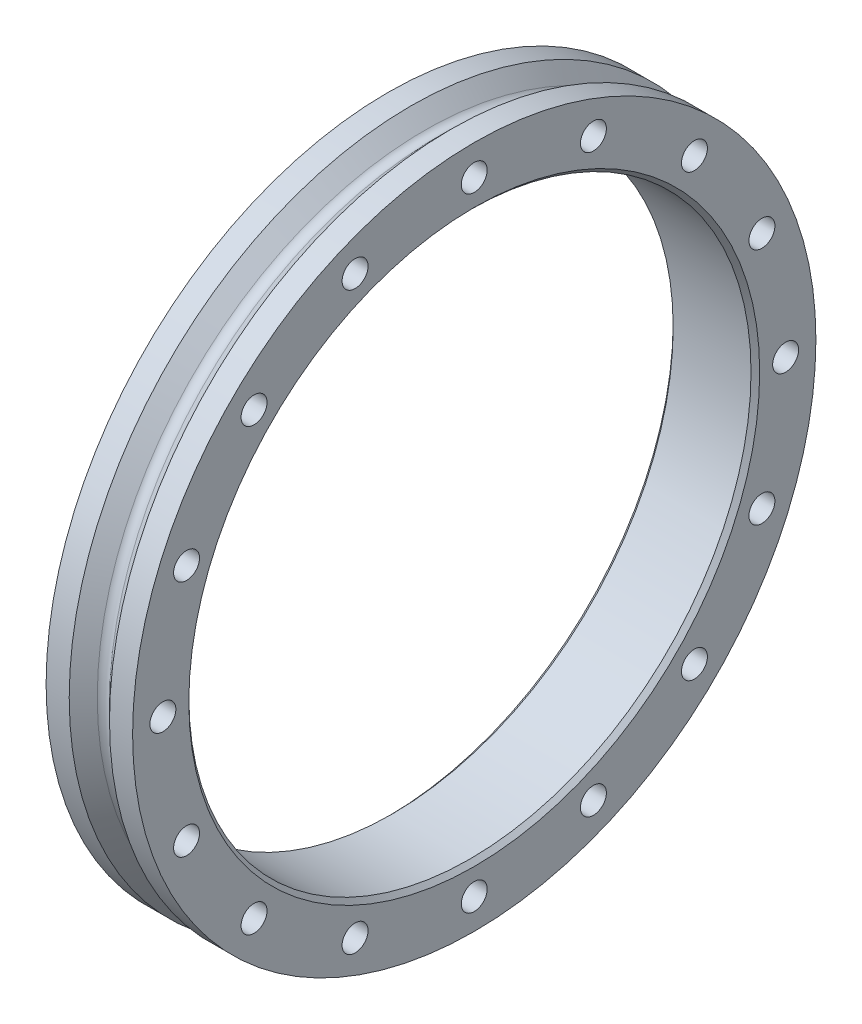
ISO-10303-21;
HEADER;
FILE_DESCRIPTION(('STEP AP214'),'2;1');
FILE_NAME('part.step','',(''),(''),'','','');
FILE_SCHEMA(('AUTOMOTIVE_DESIGN { 1 0 10303 214 1 1 1 1 }'));
ENDSEC;
DATA;
#1=APPLICATION_CONTEXT('core data for automotive mechanical design processes');
#2=APPLICATION_PROTOCOL_DEFINITION('international standard','automotive_design',2000,#1);
#3=PRODUCT_CONTEXT('',#1,'mechanical');
#4=PRODUCT('Part','Part','',(#3));
#5=PRODUCT_RELATED_PRODUCT_CATEGORY('part','',(#4));
#6=PRODUCT_DEFINITION_FORMATION('','',#4);
#7=PRODUCT_DEFINITION_CONTEXT('part definition',#1,'design');
#8=PRODUCT_DEFINITION('design','',#6,#7);
#9=PRODUCT_DEFINITION_SHAPE('','',#8);
#10=(LENGTH_UNIT() NAMED_UNIT(*) SI_UNIT(.MILLI.,.METRE.));
#11=(NAMED_UNIT(*) PLANE_ANGLE_UNIT() SI_UNIT($,.RADIAN.));
#12=(NAMED_UNIT(*) SI_UNIT($,.STERADIAN.) SOLID_ANGLE_UNIT());
#13=UNCERTAINTY_MEASURE_WITH_UNIT(LENGTH_MEASURE(1.E-05),#10,'distance_accuracy_value','');
#14=(GEOMETRIC_REPRESENTATION_CONTEXT(3) GLOBAL_UNCERTAINTY_ASSIGNED_CONTEXT((#13)) GLOBAL_UNIT_ASSIGNED_CONTEXT((#10,
#11,#12)) REPRESENTATION_CONTEXT('',''));
#15=CARTESIAN_POINT('',(0.,0.,0.));
#16=DIRECTION('',(0.,0.,1.));
#17=DIRECTION('',(1.,0.,0.));
#18=AXIS2_PLACEMENT_3D('',#15,#16,#17);
#19=CARTESIAN_POINT('',(-4.65685424949239,0.,0.));
#20=DIRECTION('',(-1.,0.,0.));
#21=DIRECTION('',(0.,0.,1.));
#22=AXIS2_PLACEMENT_3D('',#19,#20,#21);
#23=CONICAL_SURFACE('',#22,79.,0.785398163397445);
#24=CARTESIAN_POINT('',(-1.41421356237308,0.,0.));
#25=DIRECTION('',(1.,0.,0.));
#26=DIRECTION('',(0.,0.,-1.));
#27=AXIS2_PLACEMENT_3D('',#24,#25,#26);
#28=CIRCLE('',#27,75.7573593128807);
#29=CARTESIAN_POINT('',(-1.41421356237308,0.,-75.7573593128807));
#30=VERTEX_POINT('',#29);
#31=EDGE_CURVE('E39',#30,#30,#28,.F.);
#32=ORIENTED_EDGE('',*,*,#31,.T.);
#33=EDGE_LOOP('',(#32));
#34=FACE_BOUND('',#33,.T.);
#35=CARTESIAN_POINT('',(-4.65685424949239,0.,0.));
#36=DIRECTION('',(-1.,0.,0.));
#37=DIRECTION('',(0.,0.,1.));
#38=AXIS2_PLACEMENT_3D('',#35,#36,#37);
#39=CIRCLE('',#38,79.);
#40=CARTESIAN_POINT('',(-4.65685424949239,0.,79.));
#41=VERTEX_POINT('',#40);
#42=EDGE_CURVE('E58',#41,#41,#39,.T.);
#43=ORIENTED_EDGE('',*,*,#42,.F.);
#44=EDGE_LOOP('',(#43));
#45=FACE_BOUND('',#44,.T.);
#46=ADVANCED_FACE('F32',(#34,#45),#23,.T.);
#47=CARTESIAN_POINT('',(-42.0673076923077,0.,0.));
#48=DIRECTION('',(-1.,0.,0.));
#49=DIRECTION('',(0.,0.,1.));
#50=AXIS2_PLACEMENT_3D('',#47,#48,#49);
#51=CYLINDRICAL_SURFACE('',#50,79.);
#52=CARTESIAN_POINT('',(-10.,0.,0.));
#53=DIRECTION('',(-1.,0.,0.));
#54=DIRECTION('',(0.,0.,1.));
#55=AXIS2_PLACEMENT_3D('',#52,#53,#54);
#56=CIRCLE('',#55,79.);
#57=CARTESIAN_POINT('',(-10.,0.,79.));
#58=VERTEX_POINT('',#57);
#59=EDGE_CURVE('E61',#58,#58,#56,.T.);
#60=ORIENTED_EDGE('',*,*,#59,.F.);
#61=EDGE_LOOP('',(#60));
#62=FACE_BOUND('',#61,.T.);
#63=ORIENTED_EDGE('',*,*,#42,.T.);
#64=EDGE_LOOP('',(#63));
#65=FACE_BOUND('',#64,.T.);
#66=ADVANCED_FACE('F207',(#62,#65),#51,.T.);
#67=CARTESIAN_POINT('',(-10.,0.,0.));
#68=DIRECTION('',(1.,0.,0.));
#69=DIRECTION('',(0.,0.,-1.));
#70=AXIS2_PLACEMENT_3D('',#67,#68,#69);
#71=PLANE('',#70);
#72=CARTESIAN_POINT('',(-10.,50.9116882454313,-50.9116882454315));
#73=DIRECTION('',(1.,0.,0.));
#74=DIRECTION('',(0.,-0.707106781186549,-0.707106781186546));
#75=AXIS2_PLACEMENT_3D('',#72,#73,#74);
#76=CIRCLE('',#75,3.);
#77=CARTESIAN_POINT('',(-10.,48.7903679018717,-53.0330085889912));
#78=VERTEX_POINT('',#77);
#79=EDGE_CURVE('E80',#78,#78,#76,.T.);
#80=ORIENTED_EDGE('',*,*,#79,.T.);
#81=EDGE_LOOP('',(#80));
#82=FACE_BOUND('',#81,.T.);
#83=CARTESIAN_POINT('',(-10.,27.5532071302863,-66.5193263408127));
#84=DIRECTION('',(1.,0.,0.));
#85=DIRECTION('',(0.,-0.923879532511288,-0.382683432365087));
#86=AXIS2_PLACEMENT_3D('',#83,#84,#85);
#87=CIRCLE('',#86,3.);
#88=CARTESIAN_POINT('',(-10.,24.7815685327524,-67.667376637908));
#89=VERTEX_POINT('',#88);
#90=EDGE_CURVE('E123',#89,#89,#87,.T.);
#91=ORIENTED_EDGE('',*,*,#90,.T.);
#92=EDGE_LOOP('',(#91));
#93=FACE_BOUND('',#92,.T.);
#94=CARTESIAN_POINT('',(-10.,-2.51386656396706E-13,-72.));
#95=DIRECTION('',(1.,0.,0.));
#96=DIRECTION('',(0.,-1.,0.));
#97=AXIS2_PLACEMENT_3D('',#94,#95,#96);
#98=CIRCLE('',#97,3.);
#99=CARTESIAN_POINT('',(-10.,-3.00000000000025,-72.));
#100=VERTEX_POINT('',#99);
#101=EDGE_CURVE('E117',#100,#100,#98,.T.);
#102=ORIENTED_EDGE('',*,*,#101,.T.);
#103=EDGE_LOOP('',(#102));
#104=FACE_BOUND('',#103,.T.);
#105=CARTESIAN_POINT('',(-10.,-27.5532071302868,-66.5193263408125));
#106=DIRECTION('',(1.,0.,0.));
#107=DIRECTION('',(0.,-0.923879532511285,0.382683432365094));
#108=AXIS2_PLACEMENT_3D('',#105,#106,#107);
#109=CIRCLE('',#108,3.);
#110=CARTESIAN_POINT('',(-10.,-30.3248457278206,-65.3712760437173));
#111=VERTEX_POINT('',#110);
#112=EDGE_CURVE('E111',#111,#111,#109,.T.);
#113=ORIENTED_EDGE('',*,*,#112,.T.);
#114=EDGE_LOOP('',(#113));
#115=FACE_BOUND('',#114,.T.);
#116=CARTESIAN_POINT('',(-10.,-50.9116882454317,-50.9116882454312));
#117=DIRECTION('',(1.,0.,0.));
#118=DIRECTION('',(0.,-0.707106781186544,0.707106781186551));
#119=AXIS2_PLACEMENT_3D('',#116,#117,#118);
#120=CIRCLE('',#119,3.);
#121=CARTESIAN_POINT('',(-10.,-53.0330085889913,-48.7903679018715));
#122=VERTEX_POINT('',#121);
#123=EDGE_CURVE('E105',#122,#122,#120,.T.);
#124=ORIENTED_EDGE('',*,*,#123,.T.);
#125=EDGE_LOOP('',(#124));
#126=FACE_BOUND('',#125,.T.);
#127=CARTESIAN_POINT('',(-10.,-66.5193263408128,-27.5532071302861));
#128=DIRECTION('',(1.,0.,0.));
#129=DIRECTION('',(0.,-0.382683432365084,0.923879532511289));
#130=AXIS2_PLACEMENT_3D('',#127,#128,#129);
#131=CIRCLE('',#130,3.);
#132=CARTESIAN_POINT('',(-10.,-67.6673766379081,-24.7815685327522));
#133=VERTEX_POINT('',#132);
#134=EDGE_CURVE('E99',#133,#133,#131,.T.);
#135=ORIENTED_EDGE('',*,*,#134,.T.);
#136=EDGE_LOOP('',(#135));
#137=FACE_BOUND('',#136,.T.);
#138=CARTESIAN_POINT('',(-10.,-72.,0.));
#139=DIRECTION('',(1.,0.,0.));
#140=DIRECTION('',(0.,0.,1.));
#141=AXIS2_PLACEMENT_3D('',#138,#139,#140);
#142=CIRCLE('',#141,3.);
#143=CARTESIAN_POINT('',(-10.,-72.,3.));
#144=VERTEX_POINT('',#143);
#145=EDGE_CURVE('E93',#144,#144,#142,.T.);
#146=ORIENTED_EDGE('',*,*,#145,.T.);
#147=EDGE_LOOP('',(#146));
#148=FACE_BOUND('',#147,.T.);
#149=CARTESIAN_POINT('',(-10.,-66.5193263408124,27.553207130287));
#150=DIRECTION('',(1.,0.,0.));
#151=DIRECTION('',(0.,0.382683432365097,0.923879532511284));
#152=AXIS2_PLACEMENT_3D('',#149,#150,#151);
#153=CIRCLE('',#152,3.);
#154=CARTESIAN_POINT('',(-10.,-65.3712760437171,30.3248457278208));
#155=VERTEX_POINT('',#154);
#156=EDGE_CURVE('E86',#155,#155,#153,.T.);
#157=ORIENTED_EDGE('',*,*,#156,.T.);
#158=EDGE_LOOP('',(#157));
#159=FACE_BOUND('',#158,.T.);
#160=CARTESIAN_POINT('',(-10.,-50.911688245431,50.9116882454319));
#161=DIRECTION('',(1.,0.,0.));
#162=DIRECTION('',(0.,0.707106781186554,0.707106781186541));
#163=AXIS2_PLACEMENT_3D('',#160,#161,#162);
#164=CIRCLE('',#163,3.);
#165=CARTESIAN_POINT('',(-10.,-48.7903679018713,53.0330085889915));
#166=VERTEX_POINT('',#165);
#167=EDGE_CURVE('E87',#166,#166,#164,.T.);
#168=ORIENTED_EDGE('',*,*,#167,.T.);
#169=EDGE_LOOP('',(#168));
#170=FACE_BOUND('',#169,.T.);
#171=CARTESIAN_POINT('',(-10.,-27.5532071302858,66.5193263408129));
#172=DIRECTION('',(1.,0.,0.));
#173=DIRECTION('',(0.,0.923879532511291,0.382683432365081));
#174=AXIS2_PLACEMENT_3D('',#171,#172,#173);
#175=CIRCLE('',#174,3.);
#176=CARTESIAN_POINT('',(-10.,-24.7815685327519,67.6673766379082));
#177=VERTEX_POINT('',#176);
#178=EDGE_CURVE('E158',#177,#177,#175,.T.);
#179=ORIENTED_EDGE('',*,*,#178,.T.);
#180=EDGE_LOOP('',(#179));
#181=FACE_BOUND('',#180,.T.);
#182=CARTESIAN_POINT('',(-10.,7.54159969190117E-13,72.));
#183=DIRECTION('',(1.,0.,0.));
#184=DIRECTION('',(0.,1.,0.));
#185=AXIS2_PLACEMENT_3D('',#182,#183,#184);
#186=CIRCLE('',#185,3.);
#187=CARTESIAN_POINT('',(-10.,3.00000000000076,72.));
#188=VERTEX_POINT('',#187);
#189=EDGE_CURVE('E152',#188,#188,#186,.T.);
#190=ORIENTED_EDGE('',*,*,#189,.T.);
#191=EDGE_LOOP('',(#190));
#192=FACE_BOUND('',#191,.T.);
#193=CARTESIAN_POINT('',(-10.,27.5532071302872,66.5193263408123));
#194=DIRECTION('',(1.,0.,0.));
#195=DIRECTION('',(0.,0.923879532511283,-0.3826834323651));
#196=AXIS2_PLACEMENT_3D('',#193,#194,#195);
#197=CIRCLE('',#196,3.);
#198=CARTESIAN_POINT('',(-10.,30.324845727821,65.371276043717));
#199=VERTEX_POINT('',#198);
#200=EDGE_CURVE('E146',#199,#199,#197,.T.);
#201=ORIENTED_EDGE('',*,*,#200,.T.);
#202=EDGE_LOOP('',(#201));
#203=FACE_BOUND('',#202,.T.);
#204=CARTESIAN_POINT('',(-10.,50.911688245432,50.9116882454308));
#205=DIRECTION('',(1.,0.,0.));
#206=DIRECTION('',(0.,0.707106781186539,-0.707106781186556));
#207=AXIS2_PLACEMENT_3D('',#204,#205,#206);
#208=CIRCLE('',#207,3.);
#209=CARTESIAN_POINT('',(-10.,53.0330085889917,48.7903679018711));
#210=VERTEX_POINT('',#209);
#211=EDGE_CURVE('E140',#210,#210,#208,.T.);
#212=ORIENTED_EDGE('',*,*,#211,.T.);
#213=EDGE_LOOP('',(#212));
#214=FACE_BOUND('',#213,.T.);
#215=CARTESIAN_POINT('',(-10.,66.519326340813,27.5532071302856));
#216=DIRECTION('',(1.,0.,0.));
#217=DIRECTION('',(0.,0.382683432365077,-0.923879532511292));
#218=AXIS2_PLACEMENT_3D('',#215,#216,#217);
#219=CIRCLE('',#218,3.);
#220=CARTESIAN_POINT('',(-10.,67.6673766379083,24.7815685327517));
#221=VERTEX_POINT('',#220);
#222=EDGE_CURVE('E134',#221,#221,#219,.T.);
#223=ORIENTED_EDGE('',*,*,#222,.T.);
#224=EDGE_LOOP('',(#223));
#225=FACE_BOUND('',#224,.T.);
#226=CARTESIAN_POINT('',(-10.,66.5193263408126,-27.5532071302865));
#227=DIRECTION('',(1.,0.,0.));
#228=DIRECTION('',(0.,-0.382683432365091,-0.923879532511287));
#229=AXIS2_PLACEMENT_3D('',#226,#227,#228);
#230=CIRCLE('',#229,3.);
#231=CARTESIAN_POINT('',(-10.,65.3712760437174,-30.3248457278204));
#232=VERTEX_POINT('',#231);
#233=EDGE_CURVE('E74',#232,#232,#230,.T.);
#234=ORIENTED_EDGE('',*,*,#233,.T.);
#235=EDGE_LOOP('',(#234));
#236=FACE_BOUND('',#235,.T.);
#237=CARTESIAN_POINT('',(-10.,72.,0.));
#238=DIRECTION('',(1.,0.,0.));
#239=DIRECTION('',(0.,0.,-1.));
#240=AXIS2_PLACEMENT_3D('',#237,#238,#239);
#241=CIRCLE('',#240,3.);
#242=CARTESIAN_POINT('',(-10.,72.,-3.));
#243=VERTEX_POINT('',#242);
#244=EDGE_CURVE('E70',#243,#243,#241,.T.);
#245=ORIENTED_EDGE('',*,*,#244,.T.);
#246=EDGE_LOOP('',(#245));
#247=FACE_BOUND('',#246,.T.);
#248=CARTESIAN_POINT('',(-10.,0.,0.));
#249=DIRECTION('',(1.,0.,0.));
#250=DIRECTION('',(0.,0.,-1.));
#251=AXIS2_PLACEMENT_3D('',#248,#249,#250);
#252=CIRCLE('',#251,66.0000000000001);
#253=CARTESIAN_POINT('',(-10.,0.,-66.0000000000001));
#254=VERTEX_POINT('',#253);
#255=EDGE_CURVE('E43',#254,#254,#252,.T.);
#256=ORIENTED_EDGE('',*,*,#255,.T.);
#257=EDGE_LOOP('',(#256));
#258=FACE_BOUND('',#257,.T.);
#259=ORIENTED_EDGE('',*,*,#59,.T.);
#260=EDGE_LOOP('',(#259));
#261=FACE_BOUND('',#260,.T.);
#262=ADVANCED_FACE('F167',(#82,#93,#104,#115,#126,#137,#148,#159,#170,#181,#192,#203,#214,#225,
#236,#247,#258,#261),#71,.F.);
#263=CARTESIAN_POINT('',(-42.0673076923077,0.,0.));
#264=DIRECTION('',(-1.,0.,0.));
#265=DIRECTION('',(0.,0.,1.));
#266=AXIS2_PLACEMENT_3D('',#263,#264,#265);
#267=CYLINDRICAL_SURFACE('',#266,65.);
#268=CARTESIAN_POINT('',(8.99999999999997,0.,0.));
#269=DIRECTION('',(1.,0.,0.));
#270=DIRECTION('',(0.,0.,-1.));
#271=AXIS2_PLACEMENT_3D('',#268,#269,#270);
#272=CIRCLE('',#271,65.);
#273=CARTESIAN_POINT('',(8.99999999999997,0.,-65.));
#274=VERTEX_POINT('',#273);
#275=EDGE_CURVE('E47',#274,#274,#272,.T.);
#276=ORIENTED_EDGE('',*,*,#275,.T.);
#277=EDGE_LOOP('',(#276));
#278=FACE_BOUND('',#277,.T.);
#279=CARTESIAN_POINT('',(-8.99999999999994,0.,0.));
#280=DIRECTION('',(1.,0.,0.));
#281=DIRECTION('',(0.,0.,-1.));
#282=AXIS2_PLACEMENT_3D('',#279,#280,#281);
#283=CIRCLE('',#282,65.);
#284=CARTESIAN_POINT('',(-8.99999999999994,0.,-65.));
#285=VERTEX_POINT('',#284);
#286=EDGE_CURVE('E52',#285,#285,#283,.F.);
#287=ORIENTED_EDGE('',*,*,#286,.T.);
#288=EDGE_LOOP('',(#287));
#289=FACE_BOUND('',#288,.T.);
#290=ADVANCED_FACE('F182',(#278,#289),#267,.F.);
#291=CARTESIAN_POINT('',(10.,0.,0.));
#292=DIRECTION('',(1.,0.,0.));
#293=DIRECTION('',(0.,0.,-1.));
#294=AXIS2_PLACEMENT_3D('',#291,#292,#293);
#295=PLANE('',#294);
#296=CARTESIAN_POINT('',(10.,50.9116882454313,-50.9116882454315));
#297=DIRECTION('',(1.,0.,0.));
#298=DIRECTION('',(0.,-0.707106781186549,-0.707106781186546));
#299=AXIS2_PLACEMENT_3D('',#296,#297,#298);
#300=CIRCLE('',#299,3.);
#301=CARTESIAN_POINT('',(10.,48.7903679018717,-53.0330085889912));
#302=VERTEX_POINT('',#301);
#303=EDGE_CURVE('E126',#302,#302,#300,.T.);
#304=ORIENTED_EDGE('',*,*,#303,.F.);
#305=EDGE_LOOP('',(#304));
#306=FACE_BOUND('',#305,.T.);
#307=CARTESIAN_POINT('',(10.,27.5532071302863,-66.5193263408127));
#308=DIRECTION('',(1.,0.,0.));
#309=DIRECTION('',(0.,-0.923879532511288,-0.382683432365087));
#310=AXIS2_PLACEMENT_3D('',#307,#308,#309);
#311=CIRCLE('',#310,3.);
#312=CARTESIAN_POINT('',(10.,24.7815685327524,-67.667376637908));
#313=VERTEX_POINT('',#312);
#314=EDGE_CURVE('E120',#313,#313,#311,.T.);
#315=ORIENTED_EDGE('',*,*,#314,.F.);
#316=EDGE_LOOP('',(#315));
#317=FACE_BOUND('',#316,.T.);
#318=CARTESIAN_POINT('',(10.,-2.51386656396706E-13,-72.));
#319=DIRECTION('',(1.,0.,0.));
#320=DIRECTION('',(0.,-1.,0.));
#321=AXIS2_PLACEMENT_3D('',#318,#319,#320);
#322=CIRCLE('',#321,3.);
#323=CARTESIAN_POINT('',(10.,-3.00000000000025,-72.));
#324=VERTEX_POINT('',#323);
#325=EDGE_CURVE('E114',#324,#324,#322,.T.);
#326=ORIENTED_EDGE('',*,*,#325,.F.);
#327=EDGE_LOOP('',(#326));
#328=FACE_BOUND('',#327,.T.);
#329=CARTESIAN_POINT('',(10.,-27.5532071302868,-66.5193263408125));
#330=DIRECTION('',(1.,0.,0.));
#331=DIRECTION('',(0.,-0.923879532511285,0.382683432365094));
#332=AXIS2_PLACEMENT_3D('',#329,#330,#331);
#333=CIRCLE('',#332,3.);
#334=CARTESIAN_POINT('',(10.,-30.3248457278206,-65.3712760437173));
#335=VERTEX_POINT('',#334);
#336=EDGE_CURVE('E108',#335,#335,#333,.T.);
#337=ORIENTED_EDGE('',*,*,#336,.F.);
#338=EDGE_LOOP('',(#337));
#339=FACE_BOUND('',#338,.T.);
#340=CARTESIAN_POINT('',(10.,-50.9116882454317,-50.9116882454312));
#341=DIRECTION('',(1.,0.,0.));
#342=DIRECTION('',(0.,-0.707106781186544,0.707106781186551));
#343=AXIS2_PLACEMENT_3D('',#340,#341,#342);
#344=CIRCLE('',#343,3.);
#345=CARTESIAN_POINT('',(10.,-53.0330085889913,-48.7903679018715));
#346=VERTEX_POINT('',#345);
#347=EDGE_CURVE('E102',#346,#346,#344,.T.);
#348=ORIENTED_EDGE('',*,*,#347,.F.);
#349=EDGE_LOOP('',(#348));
#350=FACE_BOUND('',#349,.T.);
#351=CARTESIAN_POINT('',(10.,-66.5193263408128,-27.5532071302861));
#352=DIRECTION('',(1.,0.,0.));
#353=DIRECTION('',(0.,-0.382683432365084,0.923879532511289));
#354=AXIS2_PLACEMENT_3D('',#351,#352,#353);
#355=CIRCLE('',#354,3.);
#356=CARTESIAN_POINT('',(10.,-67.6673766379081,-24.7815685327522));
#357=VERTEX_POINT('',#356);
#358=EDGE_CURVE('E96',#357,#357,#355,.T.);
#359=ORIENTED_EDGE('',*,*,#358,.F.);
#360=EDGE_LOOP('',(#359));
#361=FACE_BOUND('',#360,.T.);
#362=CARTESIAN_POINT('',(10.,-72.,0.));
#363=DIRECTION('',(1.,0.,0.));
#364=DIRECTION('',(0.,0.,1.));
#365=AXIS2_PLACEMENT_3D('',#362,#363,#364);
#366=CIRCLE('',#365,3.);
#367=CARTESIAN_POINT('',(10.,-72.,3.));
#368=VERTEX_POINT('',#367);
#369=EDGE_CURVE('E90',#368,#368,#366,.T.);
#370=ORIENTED_EDGE('',*,*,#369,.F.);
#371=EDGE_LOOP('',(#370));
#372=FACE_BOUND('',#371,.T.);
#373=CARTESIAN_POINT('',(10.,-66.5193263408124,27.553207130287));
#374=DIRECTION('',(1.,0.,0.));
#375=DIRECTION('',(0.,0.382683432365097,0.923879532511284));
#376=AXIS2_PLACEMENT_3D('',#373,#374,#375);
#377=CIRCLE('',#376,3.);
#378=CARTESIAN_POINT('',(10.,-65.3712760437171,30.3248457278208));
#379=VERTEX_POINT('',#378);
#380=EDGE_CURVE('E83',#379,#379,#377,.T.);
#381=ORIENTED_EDGE('',*,*,#380,.F.);
#382=EDGE_LOOP('',(#381));
#383=FACE_BOUND('',#382,.T.);
#384=CARTESIAN_POINT('',(10.,-50.911688245431,50.9116882454319));
#385=DIRECTION('',(1.,0.,0.));
#386=DIRECTION('',(0.,0.707106781186554,0.707106781186541));
#387=AXIS2_PLACEMENT_3D('',#384,#385,#386);
#388=CIRCLE('',#387,3.);
#389=CARTESIAN_POINT('',(10.,-48.7903679018713,53.0330085889915));
#390=VERTEX_POINT('',#389);
#391=EDGE_CURVE('E161',#390,#390,#388,.T.);
#392=ORIENTED_EDGE('',*,*,#391,.F.);
#393=EDGE_LOOP('',(#392));
#394=FACE_BOUND('',#393,.T.);
#395=CARTESIAN_POINT('',(10.,-27.5532071302858,66.5193263408129));
#396=DIRECTION('',(1.,0.,0.));
#397=DIRECTION('',(0.,0.923879532511291,0.382683432365081));
#398=AXIS2_PLACEMENT_3D('',#395,#396,#397);
#399=CIRCLE('',#398,3.);
#400=CARTESIAN_POINT('',(10.,-24.7815685327519,67.6673766379082));
#401=VERTEX_POINT('',#400);
#402=EDGE_CURVE('E155',#401,#401,#399,.T.);
#403=ORIENTED_EDGE('',*,*,#402,.F.);
#404=EDGE_LOOP('',(#403));
#405=FACE_BOUND('',#404,.T.);
#406=CARTESIAN_POINT('',(10.,7.54159969190117E-13,72.));
#407=DIRECTION('',(1.,0.,0.));
#408=DIRECTION('',(0.,1.,0.));
#409=AXIS2_PLACEMENT_3D('',#406,#407,#408);
#410=CIRCLE('',#409,3.);
#411=CARTESIAN_POINT('',(10.,3.00000000000076,72.));
#412=VERTEX_POINT('',#411);
#413=EDGE_CURVE('E149',#412,#412,#410,.T.);
#414=ORIENTED_EDGE('',*,*,#413,.F.);
#415=EDGE_LOOP('',(#414));
#416=FACE_BOUND('',#415,.T.);
#417=CARTESIAN_POINT('',(10.,27.5532071302872,66.5193263408123));
#418=DIRECTION('',(1.,0.,0.));
#419=DIRECTION('',(0.,0.923879532511283,-0.3826834323651));
#420=AXIS2_PLACEMENT_3D('',#417,#418,#419);
#421=CIRCLE('',#420,3.);
#422=CARTESIAN_POINT('',(10.,30.324845727821,65.371276043717));
#423=VERTEX_POINT('',#422);
#424=EDGE_CURVE('E143',#423,#423,#421,.T.);
#425=ORIENTED_EDGE('',*,*,#424,.F.);
#426=EDGE_LOOP('',(#425));
#427=FACE_BOUND('',#426,.T.);
#428=CARTESIAN_POINT('',(10.,50.911688245432,50.9116882454308));
#429=DIRECTION('',(1.,0.,0.));
#430=DIRECTION('',(0.,0.707106781186539,-0.707106781186556));
#431=AXIS2_PLACEMENT_3D('',#428,#429,#430);
#432=CIRCLE('',#431,3.);
#433=CARTESIAN_POINT('',(10.,53.0330085889917,48.7903679018711));
#434=VERTEX_POINT('',#433);
#435=EDGE_CURVE('E137',#434,#434,#432,.T.);
#436=ORIENTED_EDGE('',*,*,#435,.F.);
#437=EDGE_LOOP('',(#436));
#438=FACE_BOUND('',#437,.T.);
#439=CARTESIAN_POINT('',(10.,66.519326340813,27.5532071302856));
#440=DIRECTION('',(1.,0.,0.));
#441=DIRECTION('',(0.,0.382683432365077,-0.923879532511292));
#442=AXIS2_PLACEMENT_3D('',#439,#440,#441);
#443=CIRCLE('',#442,3.);
#444=CARTESIAN_POINT('',(10.,67.6673766379083,24.7815685327517));
#445=VERTEX_POINT('',#444);
#446=EDGE_CURVE('E131',#445,#445,#443,.T.);
#447=ORIENTED_EDGE('',*,*,#446,.F.);
#448=EDGE_LOOP('',(#447));
#449=FACE_BOUND('',#448,.T.);
#450=CARTESIAN_POINT('',(10.,66.5193263408126,-27.5532071302865));
#451=DIRECTION('',(1.,0.,0.));
#452=DIRECTION('',(0.,-0.382683432365091,-0.923879532511287));
#453=AXIS2_PLACEMENT_3D('',#450,#451,#452);
#454=CIRCLE('',#453,3.);
#455=CARTESIAN_POINT('',(10.,65.3712760437174,-30.3248457278204));
#456=VERTEX_POINT('',#455);
#457=EDGE_CURVE('E77',#456,#456,#454,.T.);
#458=ORIENTED_EDGE('',*,*,#457,.F.);
#459=EDGE_LOOP('',(#458));
#460=FACE_BOUND('',#459,.T.);
#461=CARTESIAN_POINT('',(10.,72.,0.));
#462=DIRECTION('',(1.,0.,0.));
#463=DIRECTION('',(0.,0.,-1.));
#464=AXIS2_PLACEMENT_3D('',#461,#462,#463);
#465=CIRCLE('',#464,3.);
#466=CARTESIAN_POINT('',(10.,72.,-3.));
#467=VERTEX_POINT('',#466);
#468=EDGE_CURVE('E71',#467,#467,#465,.T.);
#469=ORIENTED_EDGE('',*,*,#468,.F.);
#470=EDGE_LOOP('',(#469));
#471=FACE_BOUND('',#470,.T.);
#472=CARTESIAN_POINT('',(10.,0.,0.));
#473=DIRECTION('',(1.,0.,0.));
#474=DIRECTION('',(0.,0.,-1.));
#475=AXIS2_PLACEMENT_3D('',#472,#473,#474);
#476=CIRCLE('',#475,66.);
#477=CARTESIAN_POINT('',(10.,0.,-66.));
#478=VERTEX_POINT('',#477);
#479=EDGE_CURVE('E55',#478,#478,#476,.F.);
#480=ORIENTED_EDGE('',*,*,#479,.T.);
#481=EDGE_LOOP('',(#480));
#482=FACE_BOUND('',#481,.T.);
#483=CARTESIAN_POINT('',(9.99999999999999,0.,0.));
#484=DIRECTION('',(-1.,0.,0.));
#485=DIRECTION('',(0.,0.,1.));
#486=AXIS2_PLACEMENT_3D('',#483,#484,#485);
#487=CIRCLE('',#486,79.);
#488=CARTESIAN_POINT('',(9.99999999999999,0.,79.));
#489=VERTEX_POINT('',#488);
#490=EDGE_CURVE('E64',#489,#489,#487,.T.);
#491=ORIENTED_EDGE('',*,*,#490,.F.);
#492=EDGE_LOOP('',(#491));
#493=FACE_BOUND('',#492,.T.);
#494=ADVANCED_FACE('F178',(#306,#317,#328,#339,#350,#361,#372,#383,#394,#405,#416,#427,#438,
#449,#460,#471,#482,#493),#295,.T.);
#495=CARTESIAN_POINT('',(4.65685424949241,0.,0.));
#496=DIRECTION('',(-1.,0.,0.));
#497=DIRECTION('',(0.,0.,1.));
#498=AXIS2_PLACEMENT_3D('',#495,#496,#497);
#499=CIRCLE('',#498,79.);
#500=CARTESIAN_POINT('',(4.65685424949241,0.,79.));
#501=VERTEX_POINT('',#500);
#502=EDGE_CURVE('E67',#501,#501,#499,.T.);
#503=ORIENTED_EDGE('',*,*,#502,.F.);
#504=EDGE_LOOP('',(#503));
#505=FACE_BOUND('',#504,.T.);
#506=ORIENTED_EDGE('',*,*,#490,.T.);
#507=EDGE_LOOP('',(#506));
#508=FACE_BOUND('',#507,.T.);
#509=ADVANCED_FACE('F181',(#505,#508),#51,.T.);
#510=CARTESIAN_POINT('',(4.65685424949241,0.,0.));
#511=DIRECTION('',(1.,0.,0.));
#512=DIRECTION('',(0.,0.,-1.));
#513=AXIS2_PLACEMENT_3D('',#510,#511,#512);
#514=CONICAL_SURFACE('',#513,79.,0.785398163397448);
#515=CARTESIAN_POINT('',(1.4142135623731,0.,0.));
#516=DIRECTION('',(-1.,0.,0.));
#517=DIRECTION('',(0.,0.,1.));
#518=AXIS2_PLACEMENT_3D('',#515,#516,#517);
#519=CIRCLE('',#518,75.7573593128807);
#520=CARTESIAN_POINT('',(1.4142135623731,0.,75.7573593128807));
#521=VERTEX_POINT('',#520);
#522=EDGE_CURVE('E10',#521,#521,#519,.F.);
#523=ORIENTED_EDGE('',*,*,#522,.T.);
#524=EDGE_LOOP('',(#523));
#525=FACE_BOUND('',#524,.T.);
#526=ORIENTED_EDGE('',*,*,#502,.T.);
#527=EDGE_LOOP('',(#526));
#528=FACE_BOUND('',#527,.T.);
#529=ADVANCED_FACE('F204',(#525,#528),#514,.T.);
#530=CARTESIAN_POINT('',(10.,0.,0.));
#531=DIRECTION('',(1.,0.,0.));
#532=DIRECTION('',(0.,0.,-1.));
#533=AXIS2_PLACEMENT_3D('',#530,#531,#532);
#534=CONICAL_SURFACE('',#533,66.,0.785398163397455);
#535=ORIENTED_EDGE('',*,*,#275,.F.);
#536=EDGE_LOOP('',(#535));
#537=FACE_BOUND('',#536,.T.);
#538=ORIENTED_EDGE('',*,*,#479,.F.);
#539=EDGE_LOOP('',(#538));
#540=FACE_BOUND('',#539,.T.);
#541=ADVANCED_FACE('F213',(#537,#540),#534,.F.);
#542=CARTESIAN_POINT('',(-8.99999999999994,0.,0.));
#543=DIRECTION('',(-1.,0.,0.));
#544=DIRECTION('',(0.,0.,1.));
#545=AXIS2_PLACEMENT_3D('',#542,#543,#544);
#546=CONICAL_SURFACE('',#545,65.,0.785398163397462);
#547=ORIENTED_EDGE('',*,*,#255,.F.);
#548=EDGE_LOOP('',(#547));
#549=FACE_BOUND('',#548,.T.);
#550=ORIENTED_EDGE('',*,*,#286,.F.);
#551=EDGE_LOOP('',(#550));
#552=FACE_BOUND('',#551,.T.);
#553=ADVANCED_FACE('F228',(#549,#552),#546,.F.);
#554=CARTESIAN_POINT('',(0.,0.,0.));
#555=DIRECTION('',(-1.,0.,0.));
#556=DIRECTION('',(0.,0.,1.));
#557=AXIS2_PLACEMENT_3D('',#554,#555,#556);
#558=TOROIDAL_SURFACE('',#557,77.1715728752538,2.);
#559=ORIENTED_EDGE('',*,*,#522,.F.);
#560=EDGE_LOOP('',(#559));
#561=FACE_BOUND('',#560,.T.);
#562=ORIENTED_EDGE('',*,*,#31,.F.);
#563=EDGE_LOOP('',(#562));
#564=FACE_BOUND('',#563,.T.);
#565=ADVANCED_FACE('F34',(#561,#564),#558,.F.);
#566=CARTESIAN_POINT('',(-10.,72.,0.));
#567=DIRECTION('',(1.,0.,0.));
#568=DIRECTION('',(0.,0.,-1.));
#569=AXIS2_PLACEMENT_3D('',#566,#567,#568);
#570=CYLINDRICAL_SURFACE('',#569,3.);
#571=ORIENTED_EDGE('',*,*,#244,.F.);
#572=EDGE_LOOP('',(#571));
#573=FACE_BOUND('',#572,.T.);
#574=ORIENTED_EDGE('',*,*,#468,.T.);
#575=EDGE_LOOP('',(#574));
#576=FACE_BOUND('',#575,.T.);
#577=ADVANCED_FACE('F234',(#573,#576),#570,.F.);
#578=CARTESIAN_POINT('',(-10.,66.5193263408126,-27.5532071302865));
#579=DIRECTION('',(1.,0.,0.));
#580=DIRECTION('',(0.,0.,-1.));
#581=AXIS2_PLACEMENT_3D('',#578,#579,#580);
#582=CYLINDRICAL_SURFACE('',#581,3.);
#583=ORIENTED_EDGE('',*,*,#233,.F.);
#584=EDGE_LOOP('',(#583));
#585=FACE_BOUND('',#584,.T.);
#586=ORIENTED_EDGE('',*,*,#457,.T.);
#587=EDGE_LOOP('',(#586));
#588=FACE_BOUND('',#587,.T.);
#589=ADVANCED_FACE('F282',(#585,#588),#582,.F.);
#590=CARTESIAN_POINT('',(-10.,66.519326340813,27.5532071302856));
#591=DIRECTION('',(1.,0.,0.));
#592=DIRECTION('',(0.,0.,-1.));
#593=AXIS2_PLACEMENT_3D('',#590,#591,#592);
#594=CYLINDRICAL_SURFACE('',#593,3.);
#595=ORIENTED_EDGE('',*,*,#222,.F.);
#596=EDGE_LOOP('',(#595));
#597=FACE_BOUND('',#596,.T.);
#598=ORIENTED_EDGE('',*,*,#446,.T.);
#599=EDGE_LOOP('',(#598));
#600=FACE_BOUND('',#599,.T.);
#601=ADVANCED_FACE('F285',(#597,#600),#594,.F.);
#602=CARTESIAN_POINT('',(-10.,50.911688245432,50.9116882454308));
#603=DIRECTION('',(1.,0.,0.));
#604=DIRECTION('',(0.,0.,-1.));
#605=AXIS2_PLACEMENT_3D('',#602,#603,#604);
#606=CYLINDRICAL_SURFACE('',#605,3.);
#607=ORIENTED_EDGE('',*,*,#211,.F.);
#608=EDGE_LOOP('',(#607));
#609=FACE_BOUND('',#608,.T.);
#610=ORIENTED_EDGE('',*,*,#435,.T.);
#611=EDGE_LOOP('',(#610));
#612=FACE_BOUND('',#611,.T.);
#613=ADVANCED_FACE('F310',(#609,#612),#606,.F.);
#614=CARTESIAN_POINT('',(-10.,27.5532071302872,66.5193263408123));
#615=DIRECTION('',(1.,0.,0.));
#616=DIRECTION('',(0.,0.,-1.));
#617=AXIS2_PLACEMENT_3D('',#614,#615,#616);
#618=CYLINDRICAL_SURFACE('',#617,3.);
#619=ORIENTED_EDGE('',*,*,#200,.F.);
#620=EDGE_LOOP('',(#619));
#621=FACE_BOUND('',#620,.T.);
#622=ORIENTED_EDGE('',*,*,#424,.T.);
#623=EDGE_LOOP('',(#622));
#624=FACE_BOUND('',#623,.T.);
#625=ADVANCED_FACE('F318',(#621,#624),#618,.F.);
#626=CARTESIAN_POINT('',(-10.,7.54159969190117E-13,72.));
#627=DIRECTION('',(1.,0.,0.));
#628=DIRECTION('',(0.,0.,-1.));
#629=AXIS2_PLACEMENT_3D('',#626,#627,#628);
#630=CYLINDRICAL_SURFACE('',#629,3.);
#631=ORIENTED_EDGE('',*,*,#189,.F.);
#632=EDGE_LOOP('',(#631));
#633=FACE_BOUND('',#632,.T.);
#634=ORIENTED_EDGE('',*,*,#413,.T.);
#635=EDGE_LOOP('',(#634));
#636=FACE_BOUND('',#635,.T.);
#637=ADVANCED_FACE('F326',(#633,#636),#630,.F.);
#638=CARTESIAN_POINT('',(-10.,-27.5532071302858,66.5193263408129));
#639=DIRECTION('',(1.,0.,0.));
#640=DIRECTION('',(0.,0.,-1.));
#641=AXIS2_PLACEMENT_3D('',#638,#639,#640);
#642=CYLINDRICAL_SURFACE('',#641,3.);
#643=ORIENTED_EDGE('',*,*,#178,.F.);
#644=EDGE_LOOP('',(#643));
#645=FACE_BOUND('',#644,.T.);
#646=ORIENTED_EDGE('',*,*,#402,.T.);
#647=EDGE_LOOP('',(#646));
#648=FACE_BOUND('',#647,.T.);
#649=ADVANCED_FACE('F174',(#645,#648),#642,.F.);
#650=CARTESIAN_POINT('',(-10.,-50.911688245431,50.9116882454319));
#651=DIRECTION('',(1.,0.,0.));
#652=DIRECTION('',(0.,0.,-1.));
#653=AXIS2_PLACEMENT_3D('',#650,#651,#652);
#654=CYLINDRICAL_SURFACE('',#653,3.);
#655=ORIENTED_EDGE('',*,*,#167,.F.);
#656=EDGE_LOOP('',(#655));
#657=FACE_BOUND('',#656,.T.);
#658=ORIENTED_EDGE('',*,*,#391,.T.);
#659=EDGE_LOOP('',(#658));
#660=FACE_BOUND('',#659,.T.);
#661=ADVANCED_FACE('F170',(#657,#660),#654,.F.);
#662=CARTESIAN_POINT('',(-10.,-66.5193263408124,27.553207130287));
#663=DIRECTION('',(1.,0.,0.));
#664=DIRECTION('',(0.,0.,-1.));
#665=AXIS2_PLACEMENT_3D('',#662,#663,#664);
#666=CYLINDRICAL_SURFACE('',#665,3.);
#667=ORIENTED_EDGE('',*,*,#156,.F.);
#668=EDGE_LOOP('',(#667));
#669=FACE_BOUND('',#668,.T.);
#670=ORIENTED_EDGE('',*,*,#380,.T.);
#671=EDGE_LOOP('',(#670));
#672=FACE_BOUND('',#671,.T.);
#673=ADVANCED_FACE('F173',(#669,#672),#666,.F.);
#674=CARTESIAN_POINT('',(-10.,-72.,0.));
#675=DIRECTION('',(1.,0.,0.));
#676=DIRECTION('',(0.,0.,-1.));
#677=AXIS2_PLACEMENT_3D('',#674,#675,#676);
#678=CYLINDRICAL_SURFACE('',#677,3.);
#679=ORIENTED_EDGE('',*,*,#145,.F.);
#680=EDGE_LOOP('',(#679));
#681=FACE_BOUND('',#680,.T.);
#682=ORIENTED_EDGE('',*,*,#369,.T.);
#683=EDGE_LOOP('',(#682));
#684=FACE_BOUND('',#683,.T.);
#685=ADVANCED_FACE('F270',(#681,#684),#678,.F.);
#686=CARTESIAN_POINT('',(-10.,-66.5193263408128,-27.5532071302861));
#687=DIRECTION('',(1.,0.,0.));
#688=DIRECTION('',(0.,0.,-1.));
#689=AXIS2_PLACEMENT_3D('',#686,#687,#688);
#690=CYLINDRICAL_SURFACE('',#689,3.);
#691=ORIENTED_EDGE('',*,*,#134,.F.);
#692=EDGE_LOOP('',(#691));
#693=FACE_BOUND('',#692,.T.);
#694=ORIENTED_EDGE('',*,*,#358,.T.);
#695=EDGE_LOOP('',(#694));
#696=FACE_BOUND('',#695,.T.);
#697=ADVANCED_FACE('F277',(#693,#696),#690,.F.);
#698=CARTESIAN_POINT('',(-10.,-50.9116882454317,-50.9116882454312));
#699=DIRECTION('',(1.,0.,0.));
#700=DIRECTION('',(0.,0.,-1.));
#701=AXIS2_PLACEMENT_3D('',#698,#699,#700);
#702=CYLINDRICAL_SURFACE('',#701,3.);
#703=ORIENTED_EDGE('',*,*,#123,.F.);
#704=EDGE_LOOP('',(#703));
#705=FACE_BOUND('',#704,.T.);
#706=ORIENTED_EDGE('',*,*,#347,.T.);
#707=EDGE_LOOP('',(#706));
#708=FACE_BOUND('',#707,.T.);
#709=ADVANCED_FACE('F365',(#705,#708),#702,.F.);
#710=CARTESIAN_POINT('',(-10.,-27.5532071302868,-66.5193263408125));
#711=DIRECTION('',(1.,0.,0.));
#712=DIRECTION('',(0.,0.,-1.));
#713=AXIS2_PLACEMENT_3D('',#710,#711,#712);
#714=CYLINDRICAL_SURFACE('',#713,3.);
#715=ORIENTED_EDGE('',*,*,#112,.F.);
#716=EDGE_LOOP('',(#715));
#717=FACE_BOUND('',#716,.T.);
#718=ORIENTED_EDGE('',*,*,#336,.T.);
#719=EDGE_LOOP('',(#718));
#720=FACE_BOUND('',#719,.T.);
#721=ADVANCED_FACE('F374',(#717,#720),#714,.F.);
#722=CARTESIAN_POINT('',(-10.,-2.51386656396706E-13,-72.));
#723=DIRECTION('',(1.,0.,0.));
#724=DIRECTION('',(0.,0.,-1.));
#725=AXIS2_PLACEMENT_3D('',#722,#723,#724);
#726=CYLINDRICAL_SURFACE('',#725,3.);
#727=ORIENTED_EDGE('',*,*,#101,.F.);
#728=EDGE_LOOP('',(#727));
#729=FACE_BOUND('',#728,.T.);
#730=ORIENTED_EDGE('',*,*,#325,.T.);
#731=EDGE_LOOP('',(#730));
#732=FACE_BOUND('',#731,.T.);
#733=ADVANCED_FACE('F384',(#729,#732),#726,.F.);
#734=CARTESIAN_POINT('',(-10.,27.5532071302863,-66.5193263408127));
#735=DIRECTION('',(1.,0.,0.));
#736=DIRECTION('',(0.,0.,-1.));
#737=AXIS2_PLACEMENT_3D('',#734,#735,#736);
#738=CYLINDRICAL_SURFACE('',#737,3.);
#739=ORIENTED_EDGE('',*,*,#90,.F.);
#740=EDGE_LOOP('',(#739));
#741=FACE_BOUND('',#740,.T.);
#742=ORIENTED_EDGE('',*,*,#314,.T.);
#743=EDGE_LOOP('',(#742));
#744=FACE_BOUND('',#743,.T.);
#745=ADVANCED_FACE('F394',(#741,#744),#738,.F.);
#746=CARTESIAN_POINT('',(-10.,50.9116882454313,-50.9116882454315));
#747=DIRECTION('',(1.,0.,0.));
#748=DIRECTION('',(0.,0.,-1.));
#749=AXIS2_PLACEMENT_3D('',#746,#747,#748);
#750=CYLINDRICAL_SURFACE('',#749,3.);
#751=ORIENTED_EDGE('',*,*,#79,.F.);
#752=EDGE_LOOP('',(#751));
#753=FACE_BOUND('',#752,.T.);
#754=ORIENTED_EDGE('',*,*,#303,.T.);
#755=EDGE_LOOP('',(#754));
#756=FACE_BOUND('',#755,.T.);
#757=ADVANCED_FACE('F404',(#753,#756),#750,.F.);
#758=CLOSED_SHELL('',(#46,#66,#262,#290,#494,#509,#529,#541,#553,#565,#577,#589,#601,#613,#625,
#637,#649,#661,#673,#685,#697,#709,#721,#733,#745,#757));
#759=MANIFOLD_SOLID_BREP('B2',#758);
#760=ADVANCED_BREP_SHAPE_REPRESENTATION('',(#18,#759),#14);
#761=SHAPE_DEFINITION_REPRESENTATION(#9,#760);
ENDSEC;
END-ISO-10303-21;
